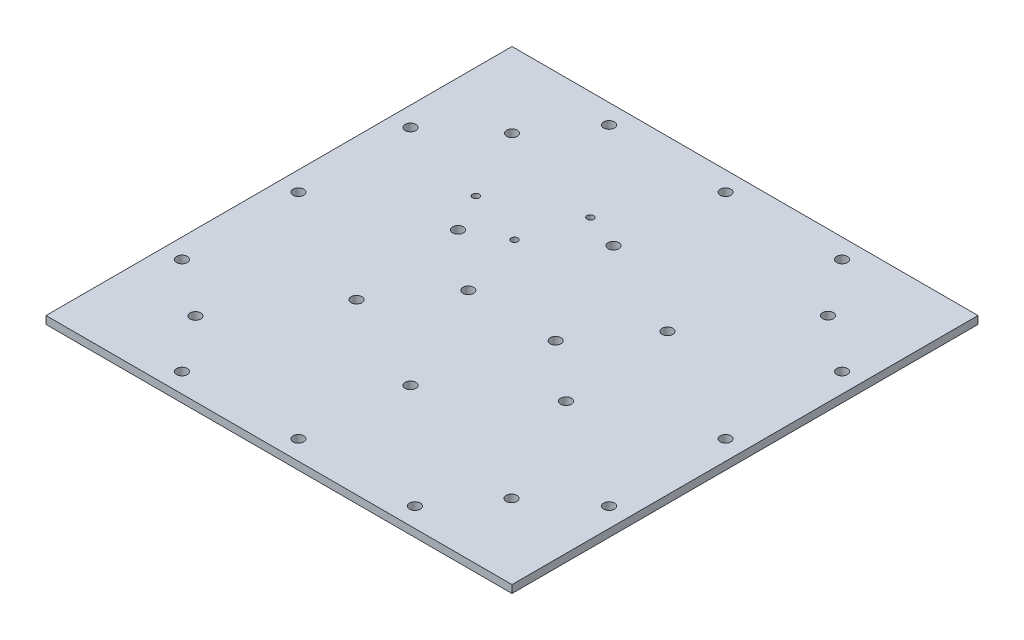
ISO-10303-21;
HEADER;
FILE_DESCRIPTION(('STEP AP214'),'2;1');
FILE_NAME('part.step','',(''),(''),'','','');
FILE_SCHEMA(('AUTOMOTIVE_DESIGN { 1 0 10303 214 1 1 1 1 }'));
ENDSEC;
DATA;
#1=APPLICATION_CONTEXT('core data for automotive mechanical design processes');
#2=APPLICATION_PROTOCOL_DEFINITION('international standard','automotive_design',2000,#1);
#3=PRODUCT_CONTEXT('',#1,'mechanical');
#4=PRODUCT('Part','Part','',(#3));
#5=PRODUCT_RELATED_PRODUCT_CATEGORY('part','',(#4));
#6=PRODUCT_DEFINITION_FORMATION('','',#4);
#7=PRODUCT_DEFINITION_CONTEXT('part definition',#1,'design');
#8=PRODUCT_DEFINITION('design','',#6,#7);
#9=PRODUCT_DEFINITION_SHAPE('','',#8);
#10=(LENGTH_UNIT() NAMED_UNIT(*) SI_UNIT(.MILLI.,.METRE.));
#11=(NAMED_UNIT(*) PLANE_ANGLE_UNIT() SI_UNIT($,.RADIAN.));
#12=(NAMED_UNIT(*) SI_UNIT($,.STERADIAN.) SOLID_ANGLE_UNIT());
#13=UNCERTAINTY_MEASURE_WITH_UNIT(LENGTH_MEASURE(1.E-05),#10,'distance_accuracy_value','');
#14=(GEOMETRIC_REPRESENTATION_CONTEXT(3) GLOBAL_UNCERTAINTY_ASSIGNED_CONTEXT((#13)) GLOBAL_UNIT_ASSIGNED_CONTEXT((#10,
#11,#12)) REPRESENTATION_CONTEXT('',''));
#15=CARTESIAN_POINT('',(0.,0.,0.));
#16=DIRECTION('',(0.,0.,1.));
#17=DIRECTION('',(1.,0.,0.));
#18=AXIS2_PLACEMENT_3D('',#15,#16,#17);
#19=CARTESIAN_POINT('',(0.,4.,20.));
#20=DIRECTION('',(0.,0.,-1.));
#21=DIRECTION('',(-1.,0.,0.));
#22=AXIS2_PLACEMENT_3D('',#19,#20,#21);
#23=PLANE('',#22);
#24=DIRECTION('',(1.,0.,0.));
#25=VECTOR('',#24,1.);
#26=CARTESIAN_POINT('',(0.,0.,20.));
#27=LINE('',#26,#25);
#28=CARTESIAN_POINT('',(-20.,0.,20.));
#29=VERTEX_POINT('',#28);
#30=CARTESIAN_POINT('',(220.,0.,20.));
#31=VERTEX_POINT('',#30);
#32=EDGE_CURVE('E101',#29,#31,#27,.T.);
#33=ORIENTED_EDGE('',*,*,#32,.T.);
#34=DIRECTION('',(0.,-1.,0.));
#35=VECTOR('',#34,1.);
#36=CARTESIAN_POINT('',(220.,4.,20.));
#37=LINE('',#36,#35);
#38=CARTESIAN_POINT('',(220.,4.,20.));
#39=VERTEX_POINT('',#38);
#40=EDGE_CURVE('E11',#39,#31,#37,.T.);
#41=ORIENTED_EDGE('',*,*,#40,.F.);
#42=DIRECTION('',(1.,0.,0.));
#43=VECTOR('',#42,1.);
#44=CARTESIAN_POINT('',(0.,4.,20.));
#45=LINE('',#44,#43);
#46=CARTESIAN_POINT('',(-20.,4.,20.));
#47=VERTEX_POINT('',#46);
#48=EDGE_CURVE('E87',#47,#39,#45,.T.);
#49=ORIENTED_EDGE('',*,*,#48,.F.);
#50=DIRECTION('',(0.,-1.,0.));
#51=VECTOR('',#50,1.);
#52=CARTESIAN_POINT('',(-20.,4.,20.));
#53=LINE('',#52,#51);
#54=EDGE_CURVE('E54',#47,#29,#53,.T.);
#55=ORIENTED_EDGE('',*,*,#54,.T.);
#56=EDGE_LOOP('',(#33,#41,#49,#55));
#57=FACE_BOUND('',#56,.T.);
#58=ADVANCED_FACE('F38',(#57),#23,.F.);
#59=CARTESIAN_POINT('',(220.,4.,0.));
#60=DIRECTION('',(-1.,0.,0.));
#61=DIRECTION('',(0.,0.,1.));
#62=AXIS2_PLACEMENT_3D('',#59,#60,#61);
#63=PLANE('',#62);
#64=DIRECTION('',(0.,0.,-1.));
#65=VECTOR('',#64,1.);
#66=CARTESIAN_POINT('',(220.,0.,0.));
#67=LINE('',#66,#65);
#68=CARTESIAN_POINT('',(220.,0.,-220.));
#69=VERTEX_POINT('',#68);
#70=EDGE_CURVE('E92',#31,#69,#67,.T.);
#71=ORIENTED_EDGE('',*,*,#70,.T.);
#72=DIRECTION('',(0.,-1.,0.));
#73=VECTOR('',#72,1.);
#74=CARTESIAN_POINT('',(220.,4.,-220.));
#75=LINE('',#74,#73);
#76=CARTESIAN_POINT('',(220.,4.,-220.));
#77=VERTEX_POINT('',#76);
#78=EDGE_CURVE('E46',#77,#69,#75,.T.);
#79=ORIENTED_EDGE('',*,*,#78,.F.);
#80=DIRECTION('',(0.,0.,-1.));
#81=VECTOR('',#80,1.);
#82=CARTESIAN_POINT('',(220.,4.,0.));
#83=LINE('',#82,#81);
#84=EDGE_CURVE('E79',#39,#77,#83,.T.);
#85=ORIENTED_EDGE('',*,*,#84,.F.);
#86=ORIENTED_EDGE('',*,*,#40,.T.);
#87=EDGE_LOOP('',(#71,#79,#85,#86));
#88=FACE_BOUND('',#87,.T.);
#89=ADVANCED_FACE('F91',(#88),#63,.F.);
#90=CARTESIAN_POINT('',(0.,4.,-220.));
#91=DIRECTION('',(0.,0.,-1.));
#92=DIRECTION('',(-1.,0.,0.));
#93=AXIS2_PLACEMENT_3D('',#90,#91,#92);
#94=PLANE('',#93);
#95=DIRECTION('',(1.,0.,0.));
#96=VECTOR('',#95,1.);
#97=CARTESIAN_POINT('',(0.,0.,-220.));
#98=LINE('',#97,#96);
#99=CARTESIAN_POINT('',(-20.,0.,-220.));
#100=VERTEX_POINT('',#99);
#101=EDGE_CURVE('E105',#100,#69,#98,.T.);
#102=ORIENTED_EDGE('',*,*,#101,.F.);
#103=DIRECTION('',(0.,-1.,0.));
#104=VECTOR('',#103,1.);
#105=CARTESIAN_POINT('',(-20.,4.,-220.));
#106=LINE('',#105,#104);
#107=CARTESIAN_POINT('',(-20.,4.,-220.));
#108=VERTEX_POINT('',#107);
#109=EDGE_CURVE('E68',#108,#100,#106,.T.);
#110=ORIENTED_EDGE('',*,*,#109,.F.);
#111=DIRECTION('',(1.,0.,0.));
#112=VECTOR('',#111,1.);
#113=CARTESIAN_POINT('',(0.,4.,-220.));
#114=LINE('',#113,#112);
#115=EDGE_CURVE('E86',#108,#77,#114,.T.);
#116=ORIENTED_EDGE('',*,*,#115,.T.);
#117=ORIENTED_EDGE('',*,*,#78,.T.);
#118=EDGE_LOOP('',(#102,#110,#116,#117));
#119=FACE_BOUND('',#118,.T.);
#120=ADVANCED_FACE('F95',(#119),#94,.T.);
#121=CARTESIAN_POINT('',(-20.,4.,0.));
#122=DIRECTION('',(-1.,0.,0.));
#123=DIRECTION('',(0.,0.,1.));
#124=AXIS2_PLACEMENT_3D('',#121,#122,#123);
#125=PLANE('',#124);
#126=DIRECTION('',(0.,0.,-1.));
#127=VECTOR('',#126,1.);
#128=CARTESIAN_POINT('',(-20.,0.,0.));
#129=LINE('',#128,#127);
#130=EDGE_CURVE('E107',#29,#100,#129,.T.);
#131=ORIENTED_EDGE('',*,*,#130,.F.);
#132=ORIENTED_EDGE('',*,*,#54,.F.);
#133=DIRECTION('',(0.,0.,-1.));
#134=VECTOR('',#133,1.);
#135=CARTESIAN_POINT('',(-20.,4.,0.));
#136=LINE('',#135,#134);
#137=EDGE_CURVE('E96',#47,#108,#136,.T.);
#138=ORIENTED_EDGE('',*,*,#137,.T.);
#139=ORIENTED_EDGE('',*,*,#109,.T.);
#140=EDGE_LOOP('',(#131,#132,#138,#139));
#141=FACE_BOUND('',#140,.T.);
#142=ADVANCED_FACE('F280',(#141),#125,.T.);
#143=CARTESIAN_POINT('',(0.,4.,0.));
#144=DIRECTION('',(0.,1.,0.));
#145=DIRECTION('',(0.,0.,1.));
#146=AXIS2_PLACEMENT_3D('',#143,#144,#145);
#147=PLANE('',#146);
#148=CARTESIAN_POINT('',(37.3783429238641,4.,-144.00490984014));
#149=DIRECTION('',(0.,1.,0.));
#150=DIRECTION('',(0.,0.,1.));
#151=AXIS2_PLACEMENT_3D('',#148,#149,#150);
#152=CIRCLE('',#151,1.7);
#153=CARTESIAN_POINT('',(37.3783429238641,4.,-142.30490984014));
#154=VERTEX_POINT('',#153);
#155=EDGE_CURVE('E271',#154,#154,#152,.T.);
#156=ORIENTED_EDGE('',*,*,#155,.F.);
#157=EDGE_LOOP('',(#156));
#158=FACE_BOUND('',#157,.T.);
#159=CARTESIAN_POINT('',(76.4406217546372,4.,-163.908135019667));
#160=DIRECTION('',(0.,1.,0.));
#161=DIRECTION('',(0.,0.,1.));
#162=AXIS2_PLACEMENT_3D('',#159,#160,#161);
#163=CIRCLE('',#162,1.69999999999999);
#164=CARTESIAN_POINT('',(76.4406217546372,4.,-162.208135019667));
#165=VERTEX_POINT('',#164);
#166=EDGE_CURVE('E265',#165,#165,#163,.T.);
#167=ORIENTED_EDGE('',*,*,#166,.F.);
#168=EDGE_LOOP('',(#167));
#169=FACE_BOUND('',#168,.T.);
#170=CARTESIAN_POINT('',(66.8610949290138,4.,-134.425383014517));
#171=DIRECTION('',(0.,1.,0.));
#172=DIRECTION('',(0.,0.,1.));
#173=AXIS2_PLACEMENT_3D('',#170,#171,#172);
#174=CIRCLE('',#173,1.69999999999999);
#175=CARTESIAN_POINT('',(66.8610949290138,4.,-132.725383014517));
#176=VERTEX_POINT('',#175);
#177=EDGE_CURVE('E259',#176,#176,#174,.T.);
#178=ORIENTED_EDGE('',*,*,#177,.F.);
#179=EDGE_LOOP('',(#178));
#180=FACE_BOUND('',#179,.T.);
#181=CARTESIAN_POINT('',(18.682720163547,4.,-181.317279836453));
#182=DIRECTION('',(0.,1.,0.));
#183=DIRECTION('',(0.,0.,1.));
#184=AXIS2_PLACEMENT_3D('',#181,#182,#183);
#185=CIRCLE('',#184,2.74999999999999);
#186=CARTESIAN_POINT('',(18.682720163547,4.,-178.567279836453));
#187=VERTEX_POINT('',#186);
#188=EDGE_CURVE('E253',#187,#187,#185,.T.);
#189=ORIENTED_EDGE('',*,*,#188,.F.);
#190=EDGE_LOOP('',(#189));
#191=FACE_BOUND('',#190,.T.);
#192=CARTESIAN_POINT('',(181.436841232894,4.,-181.317279836453));
#193=DIRECTION('',(0.,1.,0.));
#194=DIRECTION('',(0.,0.,1.));
#195=AXIS2_PLACEMENT_3D('',#192,#193,#194);
#196=CIRCLE('',#195,2.75);
#197=CARTESIAN_POINT('',(181.436841232894,4.,-178.567279836453));
#198=VERTEX_POINT('',#197);
#199=EDGE_CURVE('E247',#198,#198,#196,.T.);
#200=ORIENTED_EDGE('',*,*,#199,.F.);
#201=EDGE_LOOP('',(#200));
#202=FACE_BOUND('',#201,.T.);
#203=CARTESIAN_POINT('',(181.436841232894,4.,-18.2999999999907));
#204=DIRECTION('',(0.,1.,0.));
#205=DIRECTION('',(0.,0.,1.));
#206=AXIS2_PLACEMENT_3D('',#203,#204,#205);
#207=CIRCLE('',#206,2.75);
#208=CARTESIAN_POINT('',(181.436841232894,4.,-15.5499999999907));
#209=VERTEX_POINT('',#208);
#210=EDGE_CURVE('E241',#209,#209,#207,.T.);
#211=ORIENTED_EDGE('',*,*,#210,.F.);
#212=EDGE_LOOP('',(#211));
#213=FACE_BOUND('',#212,.T.);
#214=CARTESIAN_POINT('',(18.682720163547,4.,-18.2999999999907));
#215=DIRECTION('',(0.,1.,0.));
#216=DIRECTION('',(0.,0.,1.));
#217=AXIS2_PLACEMENT_3D('',#214,#215,#216);
#218=CIRCLE('',#217,2.74999999999999);
#219=CARTESIAN_POINT('',(18.682720163547,4.,-15.5499999999907));
#220=VERTEX_POINT('',#219);
#221=EDGE_CURVE('E235',#220,#220,#218,.T.);
#222=ORIENTED_EDGE('',*,*,#221,.F.);
#223=EDGE_LOOP('',(#222));
#224=FACE_BOUND('',#223,.T.);
#225=CARTESIAN_POINT('',(40.,4.,-210.));
#226=DIRECTION('',(0.,1.,0.));
#227=DIRECTION('',(0.,0.,1.));
#228=AXIS2_PLACEMENT_3D('',#225,#226,#227);
#229=CIRCLE('',#228,2.74999999999999);
#230=CARTESIAN_POINT('',(40.,4.,-207.25));
#231=VERTEX_POINT('',#230);
#232=EDGE_CURVE('E229',#231,#231,#229,.T.);
#233=ORIENTED_EDGE('',*,*,#232,.F.);
#234=EDGE_LOOP('',(#233));
#235=FACE_BOUND('',#234,.T.);
#236=CARTESIAN_POINT('',(100.,4.,-210.));
#237=DIRECTION('',(0.,1.,0.));
#238=DIRECTION('',(0.,0.,1.));
#239=AXIS2_PLACEMENT_3D('',#236,#237,#238);
#240=CIRCLE('',#239,2.74999999999999);
#241=CARTESIAN_POINT('',(100.,4.,-207.25));
#242=VERTEX_POINT('',#241);
#243=EDGE_CURVE('E223',#242,#242,#240,.T.);
#244=ORIENTED_EDGE('',*,*,#243,.F.);
#245=EDGE_LOOP('',(#244));
#246=FACE_BOUND('',#245,.T.);
#247=CARTESIAN_POINT('',(160.,4.,-210.));
#248=DIRECTION('',(0.,1.,0.));
#249=DIRECTION('',(0.,0.,1.));
#250=AXIS2_PLACEMENT_3D('',#247,#248,#249);
#251=CIRCLE('',#250,2.75);
#252=CARTESIAN_POINT('',(160.,4.,-207.25));
#253=VERTEX_POINT('',#252);
#254=EDGE_CURVE('E217',#253,#253,#251,.T.);
#255=ORIENTED_EDGE('',*,*,#254,.F.);
#256=EDGE_LOOP('',(#255));
#257=FACE_BOUND('',#256,.T.);
#258=CARTESIAN_POINT('',(210.,4.,-160.));
#259=DIRECTION('',(0.,1.,0.));
#260=DIRECTION('',(0.,0.,1.));
#261=AXIS2_PLACEMENT_3D('',#258,#259,#260);
#262=CIRCLE('',#261,2.74999999999997);
#263=CARTESIAN_POINT('',(210.,4.,-157.25));
#264=VERTEX_POINT('',#263);
#265=EDGE_CURVE('E211',#264,#264,#262,.T.);
#266=ORIENTED_EDGE('',*,*,#265,.F.);
#267=EDGE_LOOP('',(#266));
#268=FACE_BOUND('',#267,.T.);
#269=CARTESIAN_POINT('',(210.,4.,-100.));
#270=DIRECTION('',(0.,1.,0.));
#271=DIRECTION('',(0.,0.,1.));
#272=AXIS2_PLACEMENT_3D('',#269,#270,#271);
#273=CIRCLE('',#272,2.74999999999997);
#274=CARTESIAN_POINT('',(210.,4.,-97.2500000000001));
#275=VERTEX_POINT('',#274);
#276=EDGE_CURVE('E205',#275,#275,#273,.T.);
#277=ORIENTED_EDGE('',*,*,#276,.F.);
#278=EDGE_LOOP('',(#277));
#279=FACE_BOUND('',#278,.T.);
#280=CARTESIAN_POINT('',(210.,4.,-40.));
#281=DIRECTION('',(0.,1.,0.));
#282=DIRECTION('',(0.,0.,1.));
#283=AXIS2_PLACEMENT_3D('',#280,#281,#282);
#284=CIRCLE('',#283,2.74999999999997);
#285=CARTESIAN_POINT('',(210.,4.,-37.2500000000001));
#286=VERTEX_POINT('',#285);
#287=EDGE_CURVE('E199',#286,#286,#284,.T.);
#288=ORIENTED_EDGE('',*,*,#287,.F.);
#289=EDGE_LOOP('',(#288));
#290=FACE_BOUND('',#289,.T.);
#291=CARTESIAN_POINT('',(160.,4.,10.));
#292=DIRECTION('',(0.,1.,0.));
#293=DIRECTION('',(0.,0.,1.));
#294=AXIS2_PLACEMENT_3D('',#291,#292,#293);
#295=CIRCLE('',#294,2.74999999999997);
#296=CARTESIAN_POINT('',(160.,4.,12.75));
#297=VERTEX_POINT('',#296);
#298=EDGE_CURVE('E193',#297,#297,#295,.T.);
#299=ORIENTED_EDGE('',*,*,#298,.F.);
#300=EDGE_LOOP('',(#299));
#301=FACE_BOUND('',#300,.T.);
#302=CARTESIAN_POINT('',(100.,4.,10.));
#303=DIRECTION('',(0.,1.,0.));
#304=DIRECTION('',(0.,0.,1.));
#305=AXIS2_PLACEMENT_3D('',#302,#303,#304);
#306=CIRCLE('',#305,2.74999999999999);
#307=CARTESIAN_POINT('',(100.,4.,12.75));
#308=VERTEX_POINT('',#307);
#309=EDGE_CURVE('E187',#308,#308,#306,.T.);
#310=ORIENTED_EDGE('',*,*,#309,.F.);
#311=EDGE_LOOP('',(#310));
#312=FACE_BOUND('',#311,.T.);
#313=CARTESIAN_POINT('',(40.0000000000001,4.,10.));
#314=DIRECTION('',(0.,1.,0.));
#315=DIRECTION('',(0.,0.,1.));
#316=AXIS2_PLACEMENT_3D('',#313,#314,#315);
#317=CIRCLE('',#316,2.74999999999999);
#318=CARTESIAN_POINT('',(40.0000000000001,4.,12.75));
#319=VERTEX_POINT('',#318);
#320=EDGE_CURVE('E181',#319,#319,#317,.T.);
#321=ORIENTED_EDGE('',*,*,#320,.F.);
#322=EDGE_LOOP('',(#321));
#323=FACE_BOUND('',#322,.T.);
#324=CARTESIAN_POINT('',(-10.,4.,-40.));
#325=DIRECTION('',(0.,1.,0.));
#326=DIRECTION('',(0.,0.,1.));
#327=AXIS2_PLACEMENT_3D('',#324,#325,#326);
#328=CIRCLE('',#327,2.74999999999999);
#329=CARTESIAN_POINT('',(-10.,4.,-37.25));
#330=VERTEX_POINT('',#329);
#331=EDGE_CURVE('E175',#330,#330,#328,.T.);
#332=ORIENTED_EDGE('',*,*,#331,.F.);
#333=EDGE_LOOP('',(#332));
#334=FACE_BOUND('',#333,.T.);
#335=CARTESIAN_POINT('',(-9.99999999999998,4.,-100.));
#336=DIRECTION('',(0.,1.,0.));
#337=DIRECTION('',(0.,0.,1.));
#338=AXIS2_PLACEMENT_3D('',#335,#336,#337);
#339=CIRCLE('',#338,2.74999999999999);
#340=CARTESIAN_POINT('',(-9.99999999999998,4.,-97.25));
#341=VERTEX_POINT('',#340);
#342=EDGE_CURVE('E169',#341,#341,#339,.T.);
#343=ORIENTED_EDGE('',*,*,#342,.F.);
#344=EDGE_LOOP('',(#343));
#345=FACE_BOUND('',#344,.T.);
#346=CARTESIAN_POINT('',(-10.,4.,-157.735112714864));
#347=DIRECTION('',(0.,1.,0.));
#348=DIRECTION('',(0.,0.,1.));
#349=AXIS2_PLACEMENT_3D('',#346,#347,#348);
#350=CIRCLE('',#349,2.74999999999999);
#351=CARTESIAN_POINT('',(-10.,4.,-154.985112714864));
#352=VERTEX_POINT('',#351);
#353=EDGE_CURVE('E163',#352,#352,#350,.T.);
#354=ORIENTED_EDGE('',*,*,#353,.F.);
#355=EDGE_LOOP('',(#354));
#356=FACE_BOUND('',#355,.T.);
#357=CARTESIAN_POINT('',(94.9885447920096,4.,-157.281195140275));
#358=DIRECTION('',(0.,1.,0.));
#359=DIRECTION('',(0.,0.,1.));
#360=AXIS2_PLACEMENT_3D('',#357,#358,#359);
#361=CIRCLE('',#360,2.74999999999999);
#362=CARTESIAN_POINT('',(94.9885447920096,4.,-154.531195140275));
#363=VERTEX_POINT('',#362);
#364=EDGE_CURVE('E157',#363,#363,#361,.T.);
#365=ORIENTED_EDGE('',*,*,#364,.F.);
#366=EDGE_LOOP('',(#365));
#367=FACE_BOUND('',#366,.T.);
#368=CARTESIAN_POINT('',(47.8873022453926,4.,-124.30055005009));
#369=DIRECTION('',(0.,1.,0.));
#370=DIRECTION('',(0.,0.,1.));
#371=AXIS2_PLACEMENT_3D('',#368,#369,#370);
#372=CIRCLE('',#371,2.74999999999999);
#373=CARTESIAN_POINT('',(47.8873022453926,4.,-121.55055005009));
#374=VERTEX_POINT('',#373);
#375=EDGE_CURVE('E151',#374,#374,#372,.T.);
#376=ORIENTED_EDGE('',*,*,#375,.F.);
#377=EDGE_LOOP('',(#376));
#378=FACE_BOUND('',#377,.T.);
#379=CARTESIAN_POINT('',(105.01145520799,4.,-42.7188048597246));
#380=DIRECTION('',(0.,1.,0.));
#381=DIRECTION('',(0.,0.,1.));
#382=AXIS2_PLACEMENT_3D('',#379,#380,#381);
#383=CIRCLE('',#382,2.74999999999999);
#384=CARTESIAN_POINT('',(105.01145520799,4.,-39.9688048597247));
#385=VERTEX_POINT('',#384);
#386=EDGE_CURVE('E145',#385,#385,#383,.T.);
#387=ORIENTED_EDGE('',*,*,#386,.F.);
#388=EDGE_LOOP('',(#387));
#389=FACE_BOUND('',#388,.T.);
#390=CARTESIAN_POINT('',(147.101242546617,4.,-132.980645090185));
#391=DIRECTION('',(0.,1.,0.));
#392=DIRECTION('',(0.,0.,1.));
#393=AXIS2_PLACEMENT_3D('',#390,#391,#392);
#394=CIRCLE('',#393,2.75);
#395=CARTESIAN_POINT('',(147.101242546617,4.,-130.230645090185));
#396=VERTEX_POINT('',#395);
#397=EDGE_CURVE('E139',#396,#396,#394,.T.);
#398=ORIENTED_EDGE('',*,*,#397,.F.);
#399=EDGE_LOOP('',(#398));
#400=FACE_BOUND('',#399,.T.);
#401=CARTESIAN_POINT('',(152.112697754607,4.,-75.6994499499098));
#402=DIRECTION('',(0.,1.,0.));
#403=DIRECTION('',(0.,0.,1.));
#404=AXIS2_PLACEMENT_3D('',#401,#402,#403);
#405=CIRCLE('',#404,2.74999999999997);
#406=CARTESIAN_POINT('',(152.112697754607,4.,-72.9494499499098));
#407=VERTEX_POINT('',#406);
#408=EDGE_CURVE('E133',#407,#407,#405,.T.);
#409=ORIENTED_EDGE('',*,*,#408,.F.);
#410=EDGE_LOOP('',(#409));
#411=FACE_BOUND('',#410,.T.);
#412=CARTESIAN_POINT('',(52.898757453383,4.,-67.0193549098148));
#413=DIRECTION('',(0.,1.,0.));
#414=DIRECTION('',(0.,0.,1.));
#415=AXIS2_PLACEMENT_3D('',#412,#413,#414);
#416=CIRCLE('',#415,2.74999999999999);
#417=CARTESIAN_POINT('',(52.898757453383,4.,-64.2693549098149));
#418=VERTEX_POINT('',#417);
#419=EDGE_CURVE('E127',#418,#418,#416,.T.);
#420=ORIENTED_EDGE('',*,*,#419,.F.);
#421=EDGE_LOOP('',(#420));
#422=FACE_BOUND('',#421,.T.);
#423=CARTESIAN_POINT('',(77.5,4.,-100.));
#424=DIRECTION('',(0.,1.,0.));
#425=DIRECTION('',(0.,0.,1.));
#426=AXIS2_PLACEMENT_3D('',#423,#424,#425);
#427=CIRCLE('',#426,2.74999999999999);
#428=CARTESIAN_POINT('',(77.5,4.,-97.25));
#429=VERTEX_POINT('',#428);
#430=EDGE_CURVE('E121',#429,#429,#427,.T.);
#431=ORIENTED_EDGE('',*,*,#430,.F.);
#432=EDGE_LOOP('',(#431));
#433=FACE_BOUND('',#432,.T.);
#434=CARTESIAN_POINT('',(122.5,4.,-100.));
#435=DIRECTION('',(0.,1.,0.));
#436=DIRECTION('',(0.,0.,1.));
#437=AXIS2_PLACEMENT_3D('',#434,#435,#436);
#438=CIRCLE('',#437,2.75);
#439=CARTESIAN_POINT('',(122.5,4.,-97.25));
#440=VERTEX_POINT('',#439);
#441=EDGE_CURVE('E115',#440,#440,#438,.T.);
#442=ORIENTED_EDGE('',*,*,#441,.F.);
#443=EDGE_LOOP('',(#442));
#444=FACE_BOUND('',#443,.T.);
#445=ORIENTED_EDGE('',*,*,#48,.T.);
#446=ORIENTED_EDGE('',*,*,#84,.T.);
#447=ORIENTED_EDGE('',*,*,#115,.F.);
#448=ORIENTED_EDGE('',*,*,#137,.F.);
#449=EDGE_LOOP('',(#445,#446,#447,#448));
#450=FACE_BOUND('',#449,.T.);
#451=ADVANCED_FACE('F83',(#158,#169,#180,#191,#202,#213,#224,#235,#246,#257,#268,#279,#290,#301,
#312,#323,#334,#345,#356,#367,#378,#389,#400,#411,#422,#433,#444,#450),#147,.T.);
#452=CARTESIAN_POINT('',(0.,0.,0.));
#453=DIRECTION('',(0.,1.,0.));
#454=DIRECTION('',(0.,0.,1.));
#455=AXIS2_PLACEMENT_3D('',#452,#453,#454);
#456=PLANE('',#455);
#457=CARTESIAN_POINT('',(37.3783429238641,0.,-144.00490984014));
#458=DIRECTION('',(0.,1.,0.));
#459=DIRECTION('',(0.,0.,1.));
#460=AXIS2_PLACEMENT_3D('',#457,#458,#459);
#461=CIRCLE('',#460,1.7);
#462=CARTESIAN_POINT('',(37.3783429238641,0.,-142.30490984014));
#463=VERTEX_POINT('',#462);
#464=EDGE_CURVE('E268',#463,#463,#461,.T.);
#465=ORIENTED_EDGE('',*,*,#464,.T.);
#466=EDGE_LOOP('',(#465));
#467=FACE_BOUND('',#466,.T.);
#468=CARTESIAN_POINT('',(76.4406217546372,0.,-163.908135019667));
#469=DIRECTION('',(0.,1.,0.));
#470=DIRECTION('',(0.,0.,1.));
#471=AXIS2_PLACEMENT_3D('',#468,#469,#470);
#472=CIRCLE('',#471,1.69999999999999);
#473=CARTESIAN_POINT('',(76.4406217546372,0.,-162.208135019667));
#474=VERTEX_POINT('',#473);
#475=EDGE_CURVE('E262',#474,#474,#472,.T.);
#476=ORIENTED_EDGE('',*,*,#475,.T.);
#477=EDGE_LOOP('',(#476));
#478=FACE_BOUND('',#477,.T.);
#479=CARTESIAN_POINT('',(66.8610949290138,0.,-134.425383014517));
#480=DIRECTION('',(0.,1.,0.));
#481=DIRECTION('',(0.,0.,1.));
#482=AXIS2_PLACEMENT_3D('',#479,#480,#481);
#483=CIRCLE('',#482,1.69999999999999);
#484=CARTESIAN_POINT('',(66.8610949290138,0.,-132.725383014517));
#485=VERTEX_POINT('',#484);
#486=EDGE_CURVE('E256',#485,#485,#483,.T.);
#487=ORIENTED_EDGE('',*,*,#486,.T.);
#488=EDGE_LOOP('',(#487));
#489=FACE_BOUND('',#488,.T.);
#490=CARTESIAN_POINT('',(18.682720163547,0.,-181.317279836453));
#491=DIRECTION('',(0.,1.,0.));
#492=DIRECTION('',(0.,0.,1.));
#493=AXIS2_PLACEMENT_3D('',#490,#491,#492);
#494=CIRCLE('',#493,2.75);
#495=CARTESIAN_POINT('',(18.682720163547,0.,-178.567279836453));
#496=VERTEX_POINT('',#495);
#497=EDGE_CURVE('E250',#496,#496,#494,.T.);
#498=ORIENTED_EDGE('',*,*,#497,.T.);
#499=EDGE_LOOP('',(#498));
#500=FACE_BOUND('',#499,.T.);
#501=CARTESIAN_POINT('',(181.436841232894,0.,-181.317279836453));
#502=DIRECTION('',(0.,1.,0.));
#503=DIRECTION('',(0.,0.,1.));
#504=AXIS2_PLACEMENT_3D('',#501,#502,#503);
#505=CIRCLE('',#504,2.75);
#506=CARTESIAN_POINT('',(181.436841232894,0.,-178.567279836453));
#507=VERTEX_POINT('',#506);
#508=EDGE_CURVE('E244',#507,#507,#505,.T.);
#509=ORIENTED_EDGE('',*,*,#508,.T.);
#510=EDGE_LOOP('',(#509));
#511=FACE_BOUND('',#510,.T.);
#512=CARTESIAN_POINT('',(181.436841232894,0.,-18.2999999999907));
#513=DIRECTION('',(0.,1.,0.));
#514=DIRECTION('',(0.,0.,1.));
#515=AXIS2_PLACEMENT_3D('',#512,#513,#514);
#516=CIRCLE('',#515,2.75);
#517=CARTESIAN_POINT('',(181.436841232894,0.,-15.5499999999907));
#518=VERTEX_POINT('',#517);
#519=EDGE_CURVE('E238',#518,#518,#516,.T.);
#520=ORIENTED_EDGE('',*,*,#519,.T.);
#521=EDGE_LOOP('',(#520));
#522=FACE_BOUND('',#521,.T.);
#523=CARTESIAN_POINT('',(18.682720163547,0.,-18.2999999999907));
#524=DIRECTION('',(0.,1.,0.));
#525=DIRECTION('',(0.,0.,1.));
#526=AXIS2_PLACEMENT_3D('',#523,#524,#525);
#527=CIRCLE('',#526,2.75);
#528=CARTESIAN_POINT('',(18.682720163547,0.,-15.5499999999907));
#529=VERTEX_POINT('',#528);
#530=EDGE_CURVE('E232',#529,#529,#527,.T.);
#531=ORIENTED_EDGE('',*,*,#530,.T.);
#532=EDGE_LOOP('',(#531));
#533=FACE_BOUND('',#532,.T.);
#534=CARTESIAN_POINT('',(40.,0.,-210.));
#535=DIRECTION('',(0.,1.,0.));
#536=DIRECTION('',(0.,0.,1.));
#537=AXIS2_PLACEMENT_3D('',#534,#535,#536);
#538=CIRCLE('',#537,2.75);
#539=CARTESIAN_POINT('',(40.,0.,-207.25));
#540=VERTEX_POINT('',#539);
#541=EDGE_CURVE('E226',#540,#540,#538,.T.);
#542=ORIENTED_EDGE('',*,*,#541,.T.);
#543=EDGE_LOOP('',(#542));
#544=FACE_BOUND('',#543,.T.);
#545=CARTESIAN_POINT('',(100.,0.,-210.));
#546=DIRECTION('',(0.,1.,0.));
#547=DIRECTION('',(0.,0.,1.));
#548=AXIS2_PLACEMENT_3D('',#545,#546,#547);
#549=CIRCLE('',#548,2.75);
#550=CARTESIAN_POINT('',(100.,0.,-207.25));
#551=VERTEX_POINT('',#550);
#552=EDGE_CURVE('E220',#551,#551,#549,.T.);
#553=ORIENTED_EDGE('',*,*,#552,.T.);
#554=EDGE_LOOP('',(#553));
#555=FACE_BOUND('',#554,.T.);
#556=CARTESIAN_POINT('',(160.,0.,-210.));
#557=DIRECTION('',(0.,1.,0.));
#558=DIRECTION('',(0.,0.,1.));
#559=AXIS2_PLACEMENT_3D('',#556,#557,#558);
#560=CIRCLE('',#559,2.75);
#561=CARTESIAN_POINT('',(160.,0.,-207.25));
#562=VERTEX_POINT('',#561);
#563=EDGE_CURVE('E214',#562,#562,#560,.T.);
#564=ORIENTED_EDGE('',*,*,#563,.T.);
#565=EDGE_LOOP('',(#564));
#566=FACE_BOUND('',#565,.T.);
#567=CARTESIAN_POINT('',(210.,0.,-160.));
#568=DIRECTION('',(0.,1.,0.));
#569=DIRECTION('',(0.,0.,1.));
#570=AXIS2_PLACEMENT_3D('',#567,#568,#569);
#571=CIRCLE('',#570,2.75);
#572=CARTESIAN_POINT('',(210.,0.,-157.25));
#573=VERTEX_POINT('',#572);
#574=EDGE_CURVE('E208',#573,#573,#571,.T.);
#575=ORIENTED_EDGE('',*,*,#574,.T.);
#576=EDGE_LOOP('',(#575));
#577=FACE_BOUND('',#576,.T.);
#578=CARTESIAN_POINT('',(210.,0.,-100.));
#579=DIRECTION('',(0.,1.,0.));
#580=DIRECTION('',(0.,0.,1.));
#581=AXIS2_PLACEMENT_3D('',#578,#579,#580);
#582=CIRCLE('',#581,2.75);
#583=CARTESIAN_POINT('',(210.,0.,-97.2500000000001));
#584=VERTEX_POINT('',#583);
#585=EDGE_CURVE('E202',#584,#584,#582,.T.);
#586=ORIENTED_EDGE('',*,*,#585,.T.);
#587=EDGE_LOOP('',(#586));
#588=FACE_BOUND('',#587,.T.);
#589=CARTESIAN_POINT('',(210.,0.,-40.));
#590=DIRECTION('',(0.,1.,0.));
#591=DIRECTION('',(0.,0.,1.));
#592=AXIS2_PLACEMENT_3D('',#589,#590,#591);
#593=CIRCLE('',#592,2.75);
#594=CARTESIAN_POINT('',(210.,0.,-37.25));
#595=VERTEX_POINT('',#594);
#596=EDGE_CURVE('E196',#595,#595,#593,.T.);
#597=ORIENTED_EDGE('',*,*,#596,.T.);
#598=EDGE_LOOP('',(#597));
#599=FACE_BOUND('',#598,.T.);
#600=CARTESIAN_POINT('',(160.,0.,10.));
#601=DIRECTION('',(0.,1.,0.));
#602=DIRECTION('',(0.,0.,1.));
#603=AXIS2_PLACEMENT_3D('',#600,#601,#602);
#604=CIRCLE('',#603,2.75);
#605=CARTESIAN_POINT('',(160.,0.,12.75));
#606=VERTEX_POINT('',#605);
#607=EDGE_CURVE('E190',#606,#606,#604,.T.);
#608=ORIENTED_EDGE('',*,*,#607,.T.);
#609=EDGE_LOOP('',(#608));
#610=FACE_BOUND('',#609,.T.);
#611=CARTESIAN_POINT('',(100.,0.,10.));
#612=DIRECTION('',(0.,1.,0.));
#613=DIRECTION('',(0.,0.,1.));
#614=AXIS2_PLACEMENT_3D('',#611,#612,#613);
#615=CIRCLE('',#614,2.75);
#616=CARTESIAN_POINT('',(100.,0.,12.75));
#617=VERTEX_POINT('',#616);
#618=EDGE_CURVE('E184',#617,#617,#615,.T.);
#619=ORIENTED_EDGE('',*,*,#618,.T.);
#620=EDGE_LOOP('',(#619));
#621=FACE_BOUND('',#620,.T.);
#622=CARTESIAN_POINT('',(40.0000000000001,0.,10.));
#623=DIRECTION('',(0.,1.,0.));
#624=DIRECTION('',(0.,0.,1.));
#625=AXIS2_PLACEMENT_3D('',#622,#623,#624);
#626=CIRCLE('',#625,2.75);
#627=CARTESIAN_POINT('',(40.0000000000001,0.,12.75));
#628=VERTEX_POINT('',#627);
#629=EDGE_CURVE('E178',#628,#628,#626,.T.);
#630=ORIENTED_EDGE('',*,*,#629,.T.);
#631=EDGE_LOOP('',(#630));
#632=FACE_BOUND('',#631,.T.);
#633=CARTESIAN_POINT('',(-10.,0.,-40.));
#634=DIRECTION('',(0.,1.,0.));
#635=DIRECTION('',(0.,0.,1.));
#636=AXIS2_PLACEMENT_3D('',#633,#634,#635);
#637=CIRCLE('',#636,2.75);
#638=CARTESIAN_POINT('',(-10.,0.,-37.25));
#639=VERTEX_POINT('',#638);
#640=EDGE_CURVE('E172',#639,#639,#637,.T.);
#641=ORIENTED_EDGE('',*,*,#640,.T.);
#642=EDGE_LOOP('',(#641));
#643=FACE_BOUND('',#642,.T.);
#644=CARTESIAN_POINT('',(-9.99999999999998,0.,-100.));
#645=DIRECTION('',(0.,1.,0.));
#646=DIRECTION('',(0.,0.,1.));
#647=AXIS2_PLACEMENT_3D('',#644,#645,#646);
#648=CIRCLE('',#647,2.75);
#649=CARTESIAN_POINT('',(-9.99999999999998,0.,-97.25));
#650=VERTEX_POINT('',#649);
#651=EDGE_CURVE('E166',#650,#650,#648,.T.);
#652=ORIENTED_EDGE('',*,*,#651,.T.);
#653=EDGE_LOOP('',(#652));
#654=FACE_BOUND('',#653,.T.);
#655=CARTESIAN_POINT('',(-10.,0.,-157.735112714864));
#656=DIRECTION('',(0.,1.,0.));
#657=DIRECTION('',(0.,0.,1.));
#658=AXIS2_PLACEMENT_3D('',#655,#656,#657);
#659=CIRCLE('',#658,2.75);
#660=CARTESIAN_POINT('',(-10.,0.,-154.985112714864));
#661=VERTEX_POINT('',#660);
#662=EDGE_CURVE('E160',#661,#661,#659,.T.);
#663=ORIENTED_EDGE('',*,*,#662,.T.);
#664=EDGE_LOOP('',(#663));
#665=FACE_BOUND('',#664,.T.);
#666=CARTESIAN_POINT('',(94.9885447920096,0.,-157.281195140275));
#667=DIRECTION('',(0.,1.,0.));
#668=DIRECTION('',(0.,0.,1.));
#669=AXIS2_PLACEMENT_3D('',#666,#667,#668);
#670=CIRCLE('',#669,2.75);
#671=CARTESIAN_POINT('',(94.9885447920096,0.,-154.531195140275));
#672=VERTEX_POINT('',#671);
#673=EDGE_CURVE('E154',#672,#672,#670,.T.);
#674=ORIENTED_EDGE('',*,*,#673,.T.);
#675=EDGE_LOOP('',(#674));
#676=FACE_BOUND('',#675,.T.);
#677=CARTESIAN_POINT('',(47.8873022453926,0.,-124.30055005009));
#678=DIRECTION('',(0.,1.,0.));
#679=DIRECTION('',(0.,0.,1.));
#680=AXIS2_PLACEMENT_3D('',#677,#678,#679);
#681=CIRCLE('',#680,2.75);
#682=CARTESIAN_POINT('',(47.8873022453926,0.,-121.55055005009));
#683=VERTEX_POINT('',#682);
#684=EDGE_CURVE('E148',#683,#683,#681,.T.);
#685=ORIENTED_EDGE('',*,*,#684,.T.);
#686=EDGE_LOOP('',(#685));
#687=FACE_BOUND('',#686,.T.);
#688=CARTESIAN_POINT('',(105.01145520799,0.,-42.7188048597246));
#689=DIRECTION('',(0.,1.,0.));
#690=DIRECTION('',(0.,0.,1.));
#691=AXIS2_PLACEMENT_3D('',#688,#689,#690);
#692=CIRCLE('',#691,2.75);
#693=CARTESIAN_POINT('',(105.01145520799,0.,-39.9688048597246));
#694=VERTEX_POINT('',#693);
#695=EDGE_CURVE('E142',#694,#694,#692,.T.);
#696=ORIENTED_EDGE('',*,*,#695,.T.);
#697=EDGE_LOOP('',(#696));
#698=FACE_BOUND('',#697,.T.);
#699=CARTESIAN_POINT('',(147.101242546617,0.,-132.980645090185));
#700=DIRECTION('',(0.,1.,0.));
#701=DIRECTION('',(0.,0.,1.));
#702=AXIS2_PLACEMENT_3D('',#699,#700,#701);
#703=CIRCLE('',#702,2.75);
#704=CARTESIAN_POINT('',(147.101242546617,0.,-130.230645090185));
#705=VERTEX_POINT('',#704);
#706=EDGE_CURVE('E136',#705,#705,#703,.T.);
#707=ORIENTED_EDGE('',*,*,#706,.T.);
#708=EDGE_LOOP('',(#707));
#709=FACE_BOUND('',#708,.T.);
#710=CARTESIAN_POINT('',(152.112697754607,0.,-75.6994499499098));
#711=DIRECTION('',(0.,1.,0.));
#712=DIRECTION('',(0.,0.,1.));
#713=AXIS2_PLACEMENT_3D('',#710,#711,#712);
#714=CIRCLE('',#713,2.75);
#715=CARTESIAN_POINT('',(152.112697754607,0.,-72.9494499499098));
#716=VERTEX_POINT('',#715);
#717=EDGE_CURVE('E130',#716,#716,#714,.T.);
#718=ORIENTED_EDGE('',*,*,#717,.T.);
#719=EDGE_LOOP('',(#718));
#720=FACE_BOUND('',#719,.T.);
#721=CARTESIAN_POINT('',(52.898757453383,0.,-67.0193549098148));
#722=DIRECTION('',(0.,1.,0.));
#723=DIRECTION('',(0.,0.,1.));
#724=AXIS2_PLACEMENT_3D('',#721,#722,#723);
#725=CIRCLE('',#724,2.75);
#726=CARTESIAN_POINT('',(52.898757453383,0.,-64.2693549098148));
#727=VERTEX_POINT('',#726);
#728=EDGE_CURVE('E124',#727,#727,#725,.T.);
#729=ORIENTED_EDGE('',*,*,#728,.T.);
#730=EDGE_LOOP('',(#729));
#731=FACE_BOUND('',#730,.T.);
#732=CARTESIAN_POINT('',(77.5,0.,-100.));
#733=DIRECTION('',(0.,1.,0.));
#734=DIRECTION('',(0.,0.,1.));
#735=AXIS2_PLACEMENT_3D('',#732,#733,#734);
#736=CIRCLE('',#735,2.75);
#737=CARTESIAN_POINT('',(77.5,0.,-97.25));
#738=VERTEX_POINT('',#737);
#739=EDGE_CURVE('E118',#738,#738,#736,.T.);
#740=ORIENTED_EDGE('',*,*,#739,.T.);
#741=EDGE_LOOP('',(#740));
#742=FACE_BOUND('',#741,.T.);
#743=CARTESIAN_POINT('',(122.5,0.,-100.));
#744=DIRECTION('',(0.,1.,0.));
#745=DIRECTION('',(0.,0.,1.));
#746=AXIS2_PLACEMENT_3D('',#743,#744,#745);
#747=CIRCLE('',#746,2.75);
#748=CARTESIAN_POINT('',(122.5,0.,-97.25));
#749=VERTEX_POINT('',#748);
#750=EDGE_CURVE('E103',#749,#749,#747,.T.);
#751=ORIENTED_EDGE('',*,*,#750,.T.);
#752=EDGE_LOOP('',(#751));
#753=FACE_BOUND('',#752,.T.);
#754=ORIENTED_EDGE('',*,*,#32,.F.);
#755=ORIENTED_EDGE('',*,*,#130,.T.);
#756=ORIENTED_EDGE('',*,*,#101,.T.);
#757=ORIENTED_EDGE('',*,*,#70,.F.);
#758=EDGE_LOOP('',(#754,#755,#756,#757));
#759=FACE_BOUND('',#758,.T.);
#760=ADVANCED_FACE('F279',(#467,#478,#489,#500,#511,#522,#533,#544,#555,#566,#577,#588,#599,
#610,#621,#632,#643,#654,#665,#676,#687,#698,#709,#720,#731,#742,#753,#759),#456,.F.);
#761=CARTESIAN_POINT('',(122.5,4.,-100.));
#762=DIRECTION('',(0.,1.,0.));
#763=DIRECTION('',(0.,0.,1.));
#764=AXIS2_PLACEMENT_3D('',#761,#762,#763);
#765=CYLINDRICAL_SURFACE('',#764,2.75);
#766=ORIENTED_EDGE('',*,*,#750,.F.);
#767=EDGE_LOOP('',(#766));
#768=FACE_BOUND('',#767,.T.);
#769=ORIENTED_EDGE('',*,*,#441,.T.);
#770=EDGE_LOOP('',(#769));
#771=FACE_BOUND('',#770,.T.);
#772=ADVANCED_FACE('F334',(#768,#771),#765,.F.);
#773=CARTESIAN_POINT('',(77.5,4.,-100.));
#774=DIRECTION('',(0.,1.,0.));
#775=DIRECTION('',(0.,0.,1.));
#776=AXIS2_PLACEMENT_3D('',#773,#774,#775);
#777=CYLINDRICAL_SURFACE('',#776,2.75);
#778=ORIENTED_EDGE('',*,*,#739,.F.);
#779=EDGE_LOOP('',(#778));
#780=FACE_BOUND('',#779,.T.);
#781=ORIENTED_EDGE('',*,*,#430,.T.);
#782=EDGE_LOOP('',(#781));
#783=FACE_BOUND('',#782,.T.);
#784=ADVANCED_FACE('F336',(#780,#783),#777,.F.);
#785=CARTESIAN_POINT('',(52.898757453383,4.,-67.0193549098148));
#786=DIRECTION('',(0.,1.,0.));
#787=DIRECTION('',(0.,0.,1.));
#788=AXIS2_PLACEMENT_3D('',#785,#786,#787);
#789=CYLINDRICAL_SURFACE('',#788,2.75);
#790=ORIENTED_EDGE('',*,*,#728,.F.);
#791=EDGE_LOOP('',(#790));
#792=FACE_BOUND('',#791,.T.);
#793=ORIENTED_EDGE('',*,*,#419,.T.);
#794=EDGE_LOOP('',(#793));
#795=FACE_BOUND('',#794,.T.);
#796=ADVANCED_FACE('F343',(#792,#795),#789,.F.);
#797=CARTESIAN_POINT('',(152.112697754607,4.,-75.6994499499098));
#798=DIRECTION('',(0.,1.,0.));
#799=DIRECTION('',(0.,0.,1.));
#800=AXIS2_PLACEMENT_3D('',#797,#798,#799);
#801=CYLINDRICAL_SURFACE('',#800,2.74999999999999);
#802=ORIENTED_EDGE('',*,*,#717,.F.);
#803=EDGE_LOOP('',(#802));
#804=FACE_BOUND('',#803,.T.);
#805=ORIENTED_EDGE('',*,*,#408,.T.);
#806=EDGE_LOOP('',(#805));
#807=FACE_BOUND('',#806,.T.);
#808=ADVANCED_FACE('F416',(#804,#807),#801,.F.);
#809=CARTESIAN_POINT('',(147.101242546617,4.,-132.980645090185));
#810=DIRECTION('',(0.,1.,0.));
#811=DIRECTION('',(0.,0.,1.));
#812=AXIS2_PLACEMENT_3D('',#809,#810,#811);
#813=CYLINDRICAL_SURFACE('',#812,2.75);
#814=ORIENTED_EDGE('',*,*,#706,.F.);
#815=EDGE_LOOP('',(#814));
#816=FACE_BOUND('',#815,.T.);
#817=ORIENTED_EDGE('',*,*,#397,.T.);
#818=EDGE_LOOP('',(#817));
#819=FACE_BOUND('',#818,.T.);
#820=ADVANCED_FACE('F426',(#816,#819),#813,.F.);
#821=CARTESIAN_POINT('',(105.01145520799,4.,-42.7188048597246));
#822=DIRECTION('',(0.,1.,0.));
#823=DIRECTION('',(0.,0.,1.));
#824=AXIS2_PLACEMENT_3D('',#821,#822,#823);
#825=CYLINDRICAL_SURFACE('',#824,2.75);
#826=ORIENTED_EDGE('',*,*,#695,.F.);
#827=EDGE_LOOP('',(#826));
#828=FACE_BOUND('',#827,.T.);
#829=ORIENTED_EDGE('',*,*,#386,.T.);
#830=EDGE_LOOP('',(#829));
#831=FACE_BOUND('',#830,.T.);
#832=ADVANCED_FACE('F436',(#828,#831),#825,.F.);
#833=CARTESIAN_POINT('',(47.8873022453926,4.,-124.30055005009));
#834=DIRECTION('',(0.,1.,0.));
#835=DIRECTION('',(0.,0.,1.));
#836=AXIS2_PLACEMENT_3D('',#833,#834,#835);
#837=CYLINDRICAL_SURFACE('',#836,2.75);
#838=ORIENTED_EDGE('',*,*,#684,.F.);
#839=EDGE_LOOP('',(#838));
#840=FACE_BOUND('',#839,.T.);
#841=ORIENTED_EDGE('',*,*,#375,.T.);
#842=EDGE_LOOP('',(#841));
#843=FACE_BOUND('',#842,.T.);
#844=ADVANCED_FACE('F446',(#840,#843),#837,.F.);
#845=CARTESIAN_POINT('',(94.9885447920096,4.,-157.281195140275));
#846=DIRECTION('',(0.,1.,0.));
#847=DIRECTION('',(0.,0.,1.));
#848=AXIS2_PLACEMENT_3D('',#845,#846,#847);
#849=CYLINDRICAL_SURFACE('',#848,2.75);
#850=ORIENTED_EDGE('',*,*,#673,.F.);
#851=EDGE_LOOP('',(#850));
#852=FACE_BOUND('',#851,.T.);
#853=ORIENTED_EDGE('',*,*,#364,.T.);
#854=EDGE_LOOP('',(#853));
#855=FACE_BOUND('',#854,.T.);
#856=ADVANCED_FACE('F456',(#852,#855),#849,.F.);
#857=CARTESIAN_POINT('',(-10.,4.,-157.735112714864));
#858=DIRECTION('',(0.,1.,0.));
#859=DIRECTION('',(0.,0.,1.));
#860=AXIS2_PLACEMENT_3D('',#857,#858,#859);
#861=CYLINDRICAL_SURFACE('',#860,2.74999999999999);
#862=ORIENTED_EDGE('',*,*,#662,.F.);
#863=EDGE_LOOP('',(#862));
#864=FACE_BOUND('',#863,.T.);
#865=ORIENTED_EDGE('',*,*,#353,.T.);
#866=EDGE_LOOP('',(#865));
#867=FACE_BOUND('',#866,.T.);
#868=ADVANCED_FACE('F466',(#864,#867),#861,.F.);
#869=CARTESIAN_POINT('',(-9.99999999999998,4.,-100.));
#870=DIRECTION('',(0.,1.,0.));
#871=DIRECTION('',(0.,0.,1.));
#872=AXIS2_PLACEMENT_3D('',#869,#870,#871);
#873=CYLINDRICAL_SURFACE('',#872,2.74999999999999);
#874=ORIENTED_EDGE('',*,*,#651,.F.);
#875=EDGE_LOOP('',(#874));
#876=FACE_BOUND('',#875,.T.);
#877=ORIENTED_EDGE('',*,*,#342,.T.);
#878=EDGE_LOOP('',(#877));
#879=FACE_BOUND('',#878,.T.);
#880=ADVANCED_FACE('F476',(#876,#879),#873,.F.);
#881=CARTESIAN_POINT('',(-10.,4.,-40.));
#882=DIRECTION('',(0.,1.,0.));
#883=DIRECTION('',(0.,0.,1.));
#884=AXIS2_PLACEMENT_3D('',#881,#882,#883);
#885=CYLINDRICAL_SURFACE('',#884,2.74999999999999);
#886=ORIENTED_EDGE('',*,*,#640,.F.);
#887=EDGE_LOOP('',(#886));
#888=FACE_BOUND('',#887,.T.);
#889=ORIENTED_EDGE('',*,*,#331,.T.);
#890=EDGE_LOOP('',(#889));
#891=FACE_BOUND('',#890,.T.);
#892=ADVANCED_FACE('F486',(#888,#891),#885,.F.);
#893=CARTESIAN_POINT('',(40.0000000000001,4.,10.));
#894=DIRECTION('',(0.,1.,0.));
#895=DIRECTION('',(0.,0.,1.));
#896=AXIS2_PLACEMENT_3D('',#893,#894,#895);
#897=CYLINDRICAL_SURFACE('',#896,2.75);
#898=ORIENTED_EDGE('',*,*,#629,.F.);
#899=EDGE_LOOP('',(#898));
#900=FACE_BOUND('',#899,.T.);
#901=ORIENTED_EDGE('',*,*,#320,.T.);
#902=EDGE_LOOP('',(#901));
#903=FACE_BOUND('',#902,.T.);
#904=ADVANCED_FACE('F496',(#900,#903),#897,.F.);
#905=CARTESIAN_POINT('',(100.,4.,10.));
#906=DIRECTION('',(0.,1.,0.));
#907=DIRECTION('',(0.,0.,1.));
#908=AXIS2_PLACEMENT_3D('',#905,#906,#907);
#909=CYLINDRICAL_SURFACE('',#908,2.75);
#910=ORIENTED_EDGE('',*,*,#618,.F.);
#911=EDGE_LOOP('',(#910));
#912=FACE_BOUND('',#911,.T.);
#913=ORIENTED_EDGE('',*,*,#309,.T.);
#914=EDGE_LOOP('',(#913));
#915=FACE_BOUND('',#914,.T.);
#916=ADVANCED_FACE('F506',(#912,#915),#909,.F.);
#917=CARTESIAN_POINT('',(160.,4.,10.));
#918=DIRECTION('',(0.,1.,0.));
#919=DIRECTION('',(0.,0.,1.));
#920=AXIS2_PLACEMENT_3D('',#917,#918,#919);
#921=CYLINDRICAL_SURFACE('',#920,2.74999999999999);
#922=ORIENTED_EDGE('',*,*,#607,.F.);
#923=EDGE_LOOP('',(#922));
#924=FACE_BOUND('',#923,.T.);
#925=ORIENTED_EDGE('',*,*,#298,.T.);
#926=EDGE_LOOP('',(#925));
#927=FACE_BOUND('',#926,.T.);
#928=ADVANCED_FACE('F516',(#924,#927),#921,.F.);
#929=CARTESIAN_POINT('',(210.,4.,-40.));
#930=DIRECTION('',(0.,1.,0.));
#931=DIRECTION('',(0.,0.,1.));
#932=AXIS2_PLACEMENT_3D('',#929,#930,#931);
#933=CYLINDRICAL_SURFACE('',#932,2.74999999999999);
#934=ORIENTED_EDGE('',*,*,#596,.F.);
#935=EDGE_LOOP('',(#934));
#936=FACE_BOUND('',#935,.T.);
#937=ORIENTED_EDGE('',*,*,#287,.T.);
#938=EDGE_LOOP('',(#937));
#939=FACE_BOUND('',#938,.T.);
#940=ADVANCED_FACE('F526',(#936,#939),#933,.F.);
#941=CARTESIAN_POINT('',(210.,4.,-100.));
#942=DIRECTION('',(0.,1.,0.));
#943=DIRECTION('',(0.,0.,1.));
#944=AXIS2_PLACEMENT_3D('',#941,#942,#943);
#945=CYLINDRICAL_SURFACE('',#944,2.74999999999999);
#946=ORIENTED_EDGE('',*,*,#585,.F.);
#947=EDGE_LOOP('',(#946));
#948=FACE_BOUND('',#947,.T.);
#949=ORIENTED_EDGE('',*,*,#276,.T.);
#950=EDGE_LOOP('',(#949));
#951=FACE_BOUND('',#950,.T.);
#952=ADVANCED_FACE('F536',(#948,#951),#945,.F.);
#953=CARTESIAN_POINT('',(210.,4.,-160.));
#954=DIRECTION('',(0.,1.,0.));
#955=DIRECTION('',(0.,0.,1.));
#956=AXIS2_PLACEMENT_3D('',#953,#954,#955);
#957=CYLINDRICAL_SURFACE('',#956,2.74999999999999);
#958=ORIENTED_EDGE('',*,*,#574,.F.);
#959=EDGE_LOOP('',(#958));
#960=FACE_BOUND('',#959,.T.);
#961=ORIENTED_EDGE('',*,*,#265,.T.);
#962=EDGE_LOOP('',(#961));
#963=FACE_BOUND('',#962,.T.);
#964=ADVANCED_FACE('F546',(#960,#963),#957,.F.);
#965=CARTESIAN_POINT('',(160.,4.,-210.));
#966=DIRECTION('',(0.,1.,0.));
#967=DIRECTION('',(0.,0.,1.));
#968=AXIS2_PLACEMENT_3D('',#965,#966,#967);
#969=CYLINDRICAL_SURFACE('',#968,2.75);
#970=ORIENTED_EDGE('',*,*,#563,.F.);
#971=EDGE_LOOP('',(#970));
#972=FACE_BOUND('',#971,.T.);
#973=ORIENTED_EDGE('',*,*,#254,.T.);
#974=EDGE_LOOP('',(#973));
#975=FACE_BOUND('',#974,.T.);
#976=ADVANCED_FACE('F556',(#972,#975),#969,.F.);
#977=CARTESIAN_POINT('',(100.,4.,-210.));
#978=DIRECTION('',(0.,1.,0.));
#979=DIRECTION('',(0.,0.,1.));
#980=AXIS2_PLACEMENT_3D('',#977,#978,#979);
#981=CYLINDRICAL_SURFACE('',#980,2.75);
#982=ORIENTED_EDGE('',*,*,#552,.F.);
#983=EDGE_LOOP('',(#982));
#984=FACE_BOUND('',#983,.T.);
#985=ORIENTED_EDGE('',*,*,#243,.T.);
#986=EDGE_LOOP('',(#985));
#987=FACE_BOUND('',#986,.T.);
#988=ADVANCED_FACE('F566',(#984,#987),#981,.F.);
#989=CARTESIAN_POINT('',(40.,4.,-210.));
#990=DIRECTION('',(0.,1.,0.));
#991=DIRECTION('',(0.,0.,1.));
#992=AXIS2_PLACEMENT_3D('',#989,#990,#991);
#993=CYLINDRICAL_SURFACE('',#992,2.75);
#994=ORIENTED_EDGE('',*,*,#541,.F.);
#995=EDGE_LOOP('',(#994));
#996=FACE_BOUND('',#995,.T.);
#997=ORIENTED_EDGE('',*,*,#232,.T.);
#998=EDGE_LOOP('',(#997));
#999=FACE_BOUND('',#998,.T.);
#1000=ADVANCED_FACE('F576',(#996,#999),#993,.F.);
#1001=CARTESIAN_POINT('',(18.682720163547,4.,-18.2999999999907));
#1002=DIRECTION('',(0.,1.,0.));
#1003=DIRECTION('',(0.,0.,1.));
#1004=AXIS2_PLACEMENT_3D('',#1001,#1002,#1003);
#1005=CYLINDRICAL_SURFACE('',#1004,2.74999999999999);
#1006=ORIENTED_EDGE('',*,*,#530,.F.);
#1007=EDGE_LOOP('',(#1006));
#1008=FACE_BOUND('',#1007,.T.);
#1009=ORIENTED_EDGE('',*,*,#221,.T.);
#1010=EDGE_LOOP('',(#1009));
#1011=FACE_BOUND('',#1010,.T.);
#1012=ADVANCED_FACE('F586',(#1008,#1011),#1005,.F.);
#1013=CARTESIAN_POINT('',(181.436841232894,4.,-18.2999999999907));
#1014=DIRECTION('',(0.,1.,0.));
#1015=DIRECTION('',(0.,0.,1.));
#1016=AXIS2_PLACEMENT_3D('',#1013,#1014,#1015);
#1017=CYLINDRICAL_SURFACE('',#1016,2.75);
#1018=ORIENTED_EDGE('',*,*,#519,.F.);
#1019=EDGE_LOOP('',(#1018));
#1020=FACE_BOUND('',#1019,.T.);
#1021=ORIENTED_EDGE('',*,*,#210,.T.);
#1022=EDGE_LOOP('',(#1021));
#1023=FACE_BOUND('',#1022,.T.);
#1024=ADVANCED_FACE('F596',(#1020,#1023),#1017,.F.);
#1025=CARTESIAN_POINT('',(181.436841232894,4.,-181.317279836453));
#1026=DIRECTION('',(0.,1.,0.));
#1027=DIRECTION('',(0.,0.,1.));
#1028=AXIS2_PLACEMENT_3D('',#1025,#1026,#1027);
#1029=CYLINDRICAL_SURFACE('',#1028,2.75);
#1030=ORIENTED_EDGE('',*,*,#508,.F.);
#1031=EDGE_LOOP('',(#1030));
#1032=FACE_BOUND('',#1031,.T.);
#1033=ORIENTED_EDGE('',*,*,#199,.T.);
#1034=EDGE_LOOP('',(#1033));
#1035=FACE_BOUND('',#1034,.T.);
#1036=ADVANCED_FACE('F606',(#1032,#1035),#1029,.F.);
#1037=CARTESIAN_POINT('',(18.682720163547,4.,-181.317279836453));
#1038=DIRECTION('',(0.,1.,0.));
#1039=DIRECTION('',(0.,0.,1.));
#1040=AXIS2_PLACEMENT_3D('',#1037,#1038,#1039);
#1041=CYLINDRICAL_SURFACE('',#1040,2.74999999999999);
#1042=ORIENTED_EDGE('',*,*,#497,.F.);
#1043=EDGE_LOOP('',(#1042));
#1044=FACE_BOUND('',#1043,.T.);
#1045=ORIENTED_EDGE('',*,*,#188,.T.);
#1046=EDGE_LOOP('',(#1045));
#1047=FACE_BOUND('',#1046,.T.);
#1048=ADVANCED_FACE('F616',(#1044,#1047),#1041,.F.);
#1049=CARTESIAN_POINT('',(66.8610949290138,4.,-134.425383014517));
#1050=DIRECTION('',(0.,1.,0.));
#1051=DIRECTION('',(0.,0.,1.));
#1052=AXIS2_PLACEMENT_3D('',#1049,#1050,#1051);
#1053=CYLINDRICAL_SURFACE('',#1052,1.69999999999999);
#1054=ORIENTED_EDGE('',*,*,#486,.F.);
#1055=EDGE_LOOP('',(#1054));
#1056=FACE_BOUND('',#1055,.T.);
#1057=ORIENTED_EDGE('',*,*,#177,.T.);
#1058=EDGE_LOOP('',(#1057));
#1059=FACE_BOUND('',#1058,.T.);
#1060=ADVANCED_FACE('F626',(#1056,#1059),#1053,.F.);
#1061=CARTESIAN_POINT('',(76.4406217546372,4.,-163.908135019667));
#1062=DIRECTION('',(0.,1.,0.));
#1063=DIRECTION('',(0.,0.,1.));
#1064=AXIS2_PLACEMENT_3D('',#1061,#1062,#1063);
#1065=CYLINDRICAL_SURFACE('',#1064,1.69999999999999);
#1066=ORIENTED_EDGE('',*,*,#475,.F.);
#1067=EDGE_LOOP('',(#1066));
#1068=FACE_BOUND('',#1067,.T.);
#1069=ORIENTED_EDGE('',*,*,#166,.T.);
#1070=EDGE_LOOP('',(#1069));
#1071=FACE_BOUND('',#1070,.T.);
#1072=ADVANCED_FACE('F636',(#1068,#1071),#1065,.F.);
#1073=CARTESIAN_POINT('',(37.3783429238641,4.,-144.00490984014));
#1074=DIRECTION('',(0.,1.,0.));
#1075=DIRECTION('',(0.,0.,1.));
#1076=AXIS2_PLACEMENT_3D('',#1073,#1074,#1075);
#1077=CYLINDRICAL_SURFACE('',#1076,1.7);
#1078=ORIENTED_EDGE('',*,*,#464,.F.);
#1079=EDGE_LOOP('',(#1078));
#1080=FACE_BOUND('',#1079,.T.);
#1081=ORIENTED_EDGE('',*,*,#155,.T.);
#1082=EDGE_LOOP('',(#1081));
#1083=FACE_BOUND('',#1082,.T.);
#1084=ADVANCED_FACE('F275',(#1080,#1083),#1077,.F.);
#1085=CLOSED_SHELL('',(#58,#89,#120,#142,#451,#760,#772,#784,#796,#808,#820,#832,#844,#856,#868,
#880,#892,#904,#916,#928,#940,#952,#964,#976,#988,#1000,#1012,#1024,#1036,#1048,#1060,#1072,#1084));
#1086=MANIFOLD_SOLID_BREP('B2',#1085);
#1087=ADVANCED_BREP_SHAPE_REPRESENTATION('',(#18,#1086),#14);
#1088=SHAPE_DEFINITION_REPRESENTATION(#9,#1087);
ENDSEC;
END-ISO-10303-21;
